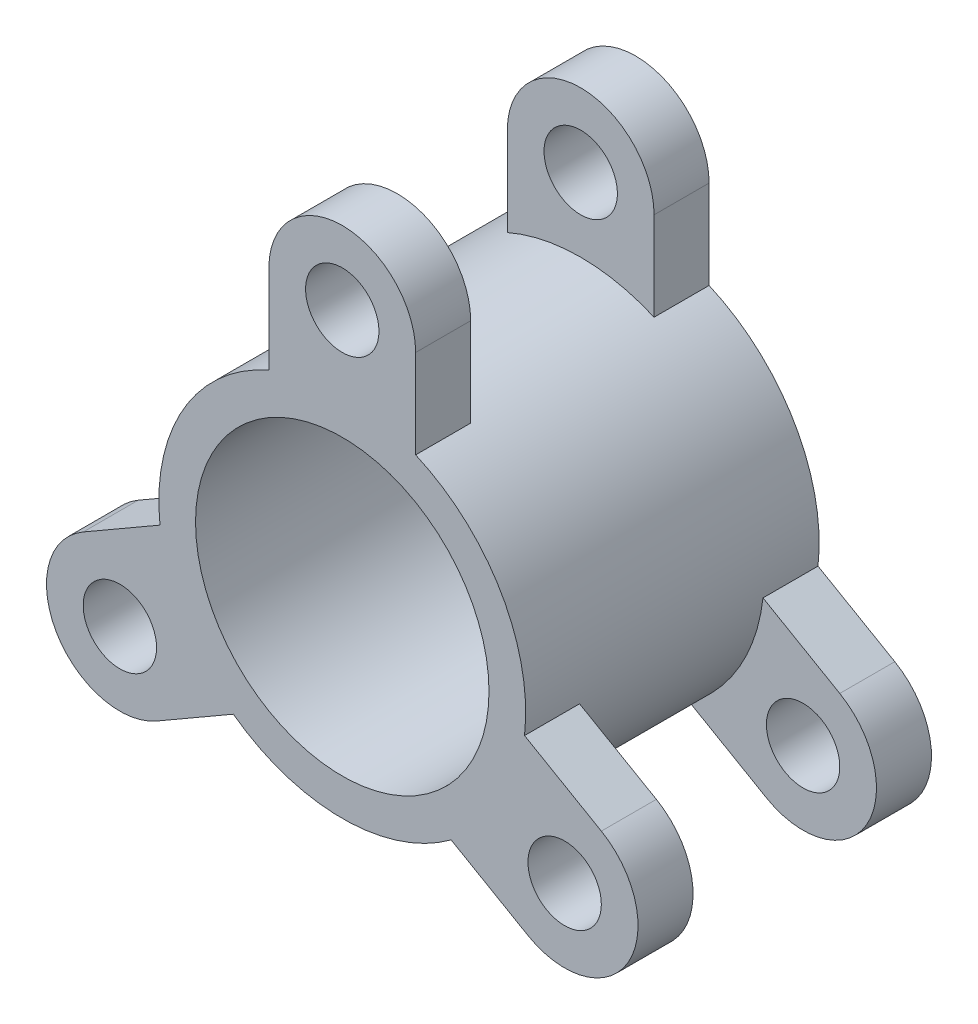
ISO-10303-21;
HEADER;
FILE_DESCRIPTION(('STEP AP214'),'2;1');
FILE_NAME('part.step','',(''),(''),'','','');
FILE_SCHEMA(('AUTOMOTIVE_DESIGN { 1 0 10303 214 1 1 1 1 }'));
ENDSEC;
DATA;
#1=APPLICATION_CONTEXT('core data for automotive mechanical design processes');
#2=APPLICATION_PROTOCOL_DEFINITION('international standard','automotive_design',2000,#1);
#3=PRODUCT_CONTEXT('',#1,'mechanical');
#4=PRODUCT('Part','Part','',(#3));
#5=PRODUCT_RELATED_PRODUCT_CATEGORY('part','',(#4));
#6=PRODUCT_DEFINITION_FORMATION('','',#4);
#7=PRODUCT_DEFINITION_CONTEXT('part definition',#1,'design');
#8=PRODUCT_DEFINITION('design','',#6,#7);
#9=PRODUCT_DEFINITION_SHAPE('','',#8);
#10=(LENGTH_UNIT() NAMED_UNIT(*) SI_UNIT(.MILLI.,.METRE.));
#11=(NAMED_UNIT(*) PLANE_ANGLE_UNIT() SI_UNIT($,.RADIAN.));
#12=(NAMED_UNIT(*) SI_UNIT($,.STERADIAN.) SOLID_ANGLE_UNIT());
#13=UNCERTAINTY_MEASURE_WITH_UNIT(LENGTH_MEASURE(1.E-05),#10,'distance_accuracy_value','');
#14=(GEOMETRIC_REPRESENTATION_CONTEXT(3) GLOBAL_UNCERTAINTY_ASSIGNED_CONTEXT((#13)) GLOBAL_UNIT_ASSIGNED_CONTEXT((#10,
#11,#12)) REPRESENTATION_CONTEXT('',''));
#15=CARTESIAN_POINT('',(0.,0.,0.));
#16=DIRECTION('',(0.,0.,1.));
#17=DIRECTION('',(1.,0.,0.));
#18=AXIS2_PLACEMENT_3D('',#15,#16,#17);
#19=CARTESIAN_POINT('',(20.,0.,80.));
#20=DIRECTION('',(1.,0.,0.));
#21=DIRECTION('',(0.,0.,-1.));
#22=AXIS2_PLACEMENT_3D('',#19,#20,#21);
#23=PLANE('',#22);
#24=DIRECTION('',(0.,1.,0.));
#25=VECTOR('',#24,1.);
#26=CARTESIAN_POINT('',(20.,0.,15.));
#27=LINE('',#26,#25);
#28=CARTESIAN_POINT('',(20.,45.8257569495584,15.));
#29=VERTEX_POINT('',#28);
#30=CARTESIAN_POINT('',(20.,70.,15.));
#31=VERTEX_POINT('',#30);
#32=EDGE_CURVE('E290',#29,#31,#27,.T.);
#33=ORIENTED_EDGE('',*,*,#32,.F.);
#34=DIRECTION('',(0.,0.,-1.));
#35=VECTOR('',#34,1.);
#36=CARTESIAN_POINT('',(20.,45.8257569495584,80.));
#37=LINE('',#36,#35);
#38=CARTESIAN_POINT('',(20.,45.8257569495584,0.));
#39=VERTEX_POINT('',#38);
#40=EDGE_CURVE('E51',#29,#39,#37,.T.);
#41=ORIENTED_EDGE('',*,*,#40,.T.);
#42=DIRECTION('',(0.,-1.,0.));
#43=VECTOR('',#42,1.);
#44=CARTESIAN_POINT('',(20.,0.,0.));
#45=LINE('',#44,#43);
#46=CARTESIAN_POINT('',(20.,70.,0.));
#47=VERTEX_POINT('',#46);
#48=EDGE_CURVE('E294',#47,#39,#45,.T.);
#49=ORIENTED_EDGE('',*,*,#48,.F.);
#50=DIRECTION('',(0.,0.,-1.));
#51=VECTOR('',#50,1.);
#52=CARTESIAN_POINT('',(20.,70.,80.));
#53=LINE('',#52,#51);
#54=EDGE_CURVE('E390',#31,#47,#53,.T.);
#55=ORIENTED_EDGE('',*,*,#54,.F.);
#56=EDGE_LOOP('',(#33,#41,#49,#55));
#57=FACE_BOUND('',#56,.T.);
#58=ADVANCED_FACE('F41',(#57),#23,.T.);
#59=CARTESIAN_POINT('',(0.,70.,80.));
#60=DIRECTION('',(0.,0.,-1.));
#61=DIRECTION('',(-1.,0.,0.));
#62=AXIS2_PLACEMENT_3D('',#59,#60,#61);
#63=CYLINDRICAL_SURFACE('',#62,20.);
#64=DIRECTION('',(0.,0.,-1.));
#65=VECTOR('',#64,1.);
#66=CARTESIAN_POINT('',(-20.,70.,80.));
#67=LINE('',#66,#65);
#68=CARTESIAN_POINT('',(-20.,70.,15.));
#69=VERTEX_POINT('',#68);
#70=CARTESIAN_POINT('',(-20.,70.,0.));
#71=VERTEX_POINT('',#70);
#72=EDGE_CURVE('E385',#69,#71,#67,.T.);
#73=ORIENTED_EDGE('',*,*,#72,.F.);
#74=CARTESIAN_POINT('',(0.,70.,15.));
#75=DIRECTION('',(0.,0.,-1.));
#76=DIRECTION('',(-1.,0.,0.));
#77=AXIS2_PLACEMENT_3D('',#74,#75,#76);
#78=CIRCLE('',#77,20.);
#79=EDGE_CURVE('E468',#69,#31,#78,.T.);
#80=ORIENTED_EDGE('',*,*,#79,.T.);
#81=ORIENTED_EDGE('',*,*,#54,.T.);
#82=CARTESIAN_POINT('',(0.,70.,0.));
#83=DIRECTION('',(0.,0.,1.));
#84=DIRECTION('',(1.,0.,0.));
#85=AXIS2_PLACEMENT_3D('',#82,#83,#84);
#86=CIRCLE('',#85,20.);
#87=EDGE_CURVE('E300',#47,#71,#86,.T.);
#88=ORIENTED_EDGE('',*,*,#87,.T.);
#89=EDGE_LOOP('',(#73,#80,#81,#88));
#90=FACE_BOUND('',#89,.T.);
#91=ADVANCED_FACE('F505',(#90),#63,.T.);
#92=CARTESIAN_POINT('',(-20.,0.,80.));
#93=DIRECTION('',(1.,0.,0.));
#94=DIRECTION('',(0.,0.,-1.));
#95=AXIS2_PLACEMENT_3D('',#92,#93,#94);
#96=PLANE('',#95);
#97=DIRECTION('',(0.,0.,-1.));
#98=VECTOR('',#97,1.);
#99=CARTESIAN_POINT('',(-20.,45.8257569495584,80.));
#100=LINE('',#99,#98);
#101=CARTESIAN_POINT('',(-20.,45.8257569495584,15.));
#102=VERTEX_POINT('',#101);
#103=CARTESIAN_POINT('',(-20.,45.8257569495584,0.));
#104=VERTEX_POINT('',#103);
#105=EDGE_CURVE('E382',#102,#104,#100,.T.);
#106=ORIENTED_EDGE('',*,*,#105,.F.);
#107=DIRECTION('',(0.,1.,0.));
#108=VECTOR('',#107,1.);
#109=CARTESIAN_POINT('',(-20.,0.,15.));
#110=LINE('',#109,#108);
#111=EDGE_CURVE('E464',#102,#69,#110,.T.);
#112=ORIENTED_EDGE('',*,*,#111,.T.);
#113=ORIENTED_EDGE('',*,*,#72,.T.);
#114=DIRECTION('',(0.,-1.,0.));
#115=VECTOR('',#114,1.);
#116=CARTESIAN_POINT('',(-20.,0.,0.));
#117=LINE('',#116,#115);
#118=EDGE_CURVE('E304',#71,#104,#117,.T.);
#119=ORIENTED_EDGE('',*,*,#118,.T.);
#120=EDGE_LOOP('',(#106,#112,#113,#119));
#121=FACE_BOUND('',#120,.T.);
#122=ADVANCED_FACE('F510',(#121),#96,.F.);
#123=CARTESIAN_POINT('',(-9.99999999999998,17.3205080756887,80.));
#124=DIRECTION('',(-0.5,0.866025403784438,0.));
#125=DIRECTION('',(-0.866025403784439,-0.5,0.));
#126=AXIS2_PLACEMENT_3D('',#123,#124,#125);
#127=PLANE('',#126);
#128=DIRECTION('',(-0.866025403784439,-0.5,0.));
#129=VECTOR('',#128,1.);
#130=CARTESIAN_POINT('',(-9.99999999999998,17.3205080756887,15.));
#131=LINE('',#130,#129);
#132=CARTESIAN_POINT('',(-49.6862696659689,-5.59237039909048,15.));
#133=VERTEX_POINT('',#132);
#134=CARTESIAN_POINT('',(-70.6217782649107,-17.6794919243113,15.));
#135=VERTEX_POINT('',#134);
#136=EDGE_CURVE('E461',#133,#135,#131,.T.);
#137=ORIENTED_EDGE('',*,*,#136,.F.);
#138=DIRECTION('',(0.,0.,-1.));
#139=VECTOR('',#138,1.);
#140=CARTESIAN_POINT('',(-49.6862696659689,-5.5923703990905,80.));
#141=LINE('',#140,#139);
#142=CARTESIAN_POINT('',(-49.6862696659689,-5.5923703990905,0.));
#143=VERTEX_POINT('',#142);
#144=EDGE_CURVE('E377',#133,#143,#141,.T.);
#145=ORIENTED_EDGE('',*,*,#144,.T.);
#146=DIRECTION('',(0.866025403784439,0.5,0.));
#147=VECTOR('',#146,1.);
#148=CARTESIAN_POINT('',(-9.99999999999998,17.3205080756887,0.));
#149=LINE('',#148,#147);
#150=CARTESIAN_POINT('',(-70.6217782649107,-17.6794919243113,0.));
#151=VERTEX_POINT('',#150);
#152=EDGE_CURVE('E308',#151,#143,#149,.T.);
#153=ORIENTED_EDGE('',*,*,#152,.F.);
#154=DIRECTION('',(0.,0.,-1.));
#155=VECTOR('',#154,1.);
#156=CARTESIAN_POINT('',(-70.6217782649107,-17.6794919243113,80.));
#157=LINE('',#156,#155);
#158=EDGE_CURVE('E372',#135,#151,#157,.T.);
#159=ORIENTED_EDGE('',*,*,#158,.F.);
#160=EDGE_LOOP('',(#137,#145,#153,#159));
#161=FACE_BOUND('',#160,.T.);
#162=ADVANCED_FACE('F532',(#161),#127,.T.);
#163=CARTESIAN_POINT('',(-60.6217782649107,-35.,80.));
#164=DIRECTION('',(0.,0.,-1.));
#165=DIRECTION('',(-1.,0.,0.));
#166=AXIS2_PLACEMENT_3D('',#163,#164,#165);
#167=CYLINDRICAL_SURFACE('',#166,20.);
#168=DIRECTION('',(0.,0.,-1.));
#169=VECTOR('',#168,1.);
#170=CARTESIAN_POINT('',(-50.6217782649107,-52.3205080756887,80.));
#171=LINE('',#170,#169);
#172=CARTESIAN_POINT('',(-50.6217782649107,-52.3205080756888,15.));
#173=VERTEX_POINT('',#172);
#174=CARTESIAN_POINT('',(-50.6217782649107,-52.3205080756887,0.));
#175=VERTEX_POINT('',#174);
#176=EDGE_CURVE('E367',#173,#175,#171,.T.);
#177=ORIENTED_EDGE('',*,*,#176,.F.);
#178=CARTESIAN_POINT('',(-60.6217782649107,-35.,15.));
#179=DIRECTION('',(0.,0.,-1.));
#180=DIRECTION('',(-1.,0.,0.));
#181=AXIS2_PLACEMENT_3D('',#178,#179,#180);
#182=CIRCLE('',#181,20.);
#183=EDGE_CURVE('E457',#173,#135,#182,.T.);
#184=ORIENTED_EDGE('',*,*,#183,.T.);
#185=ORIENTED_EDGE('',*,*,#158,.T.);
#186=CARTESIAN_POINT('',(-60.6217782649107,-35.,0.));
#187=DIRECTION('',(0.,0.,1.));
#188=DIRECTION('',(1.,0.,0.));
#189=AXIS2_PLACEMENT_3D('',#186,#187,#188);
#190=CIRCLE('',#189,20.);
#191=EDGE_CURVE('E312',#151,#175,#190,.T.);
#192=ORIENTED_EDGE('',*,*,#191,.T.);
#193=EDGE_LOOP('',(#177,#184,#185,#192));
#194=FACE_BOUND('',#193,.T.);
#195=ADVANCED_FACE('F537',(#194),#167,.T.);
#196=CARTESIAN_POINT('',(9.99999999999998,-17.3205080756887,80.));
#197=DIRECTION('',(-0.5,0.866025403784438,0.));
#198=DIRECTION('',(-0.866025403784438,-0.5,0.));
#199=AXIS2_PLACEMENT_3D('',#196,#197,#198);
#200=PLANE('',#199);
#201=DIRECTION('',(0.,0.,-1.));
#202=VECTOR('',#201,1.);
#203=CARTESIAN_POINT('',(-29.6862696659689,-40.233386550468,80.));
#204=LINE('',#203,#202);
#205=CARTESIAN_POINT('',(-29.6862696659689,-40.233386550468,15.));
#206=VERTEX_POINT('',#205);
#207=CARTESIAN_POINT('',(-29.6862696659689,-40.233386550468,0.));
#208=VERTEX_POINT('',#207);
#209=EDGE_CURVE('E363',#206,#208,#204,.T.);
#210=ORIENTED_EDGE('',*,*,#209,.F.);
#211=DIRECTION('',(-0.866025403784438,-0.5,0.));
#212=VECTOR('',#211,1.);
#213=CARTESIAN_POINT('',(9.99999999999998,-17.3205080756887,15.));
#214=LINE('',#213,#212);
#215=EDGE_CURVE('E453',#206,#173,#214,.T.);
#216=ORIENTED_EDGE('',*,*,#215,.T.);
#217=ORIENTED_EDGE('',*,*,#176,.T.);
#218=DIRECTION('',(0.866025403784438,0.5,0.));
#219=VECTOR('',#218,1.);
#220=CARTESIAN_POINT('',(9.99999999999998,-17.3205080756887,0.));
#221=LINE('',#220,#219);
#222=EDGE_CURVE('E316',#175,#208,#221,.T.);
#223=ORIENTED_EDGE('',*,*,#222,.T.);
#224=EDGE_LOOP('',(#210,#216,#217,#223));
#225=FACE_BOUND('',#224,.T.);
#226=ADVANCED_FACE('F541',(#225),#200,.F.);
#227=CARTESIAN_POINT('',(-9.99999999999998,-17.3205080756888,80.));
#228=DIRECTION('',(-0.5,-0.866025403784439,0.));
#229=DIRECTION('',(0.866025403784439,-0.5,0.));
#230=AXIS2_PLACEMENT_3D('',#227,#228,#229);
#231=PLANE('',#230);
#232=DIRECTION('',(0.866025403784439,-0.5,0.));
#233=VECTOR('',#232,1.);
#234=CARTESIAN_POINT('',(-9.99999999999998,-17.3205080756888,15.));
#235=LINE('',#234,#233);
#236=CARTESIAN_POINT('',(29.6862696659689,-40.2333865504679,15.));
#237=VERTEX_POINT('',#236);
#238=CARTESIAN_POINT('',(50.6217782649108,-52.3205080756887,15.));
#239=VERTEX_POINT('',#238);
#240=EDGE_CURVE('E442',#237,#239,#235,.T.);
#241=ORIENTED_EDGE('',*,*,#240,.F.);
#242=DIRECTION('',(0.,0.,-1.));
#243=VECTOR('',#242,1.);
#244=CARTESIAN_POINT('',(29.6862696659689,-40.2333865504679,80.));
#245=LINE('',#244,#243);
#246=CARTESIAN_POINT('',(29.6862696659689,-40.2333865504679,0.));
#247=VERTEX_POINT('',#246);
#248=EDGE_CURVE('E358',#237,#247,#245,.T.);
#249=ORIENTED_EDGE('',*,*,#248,.T.);
#250=DIRECTION('',(-0.866025403784439,0.5,0.));
#251=VECTOR('',#250,1.);
#252=CARTESIAN_POINT('',(-9.99999999999998,-17.3205080756888,0.));
#253=LINE('',#252,#251);
#254=CARTESIAN_POINT('',(50.6217782649108,-52.3205080756887,0.));
#255=VERTEX_POINT('',#254);
#256=EDGE_CURVE('E320',#255,#247,#253,.T.);
#257=ORIENTED_EDGE('',*,*,#256,.F.);
#258=DIRECTION('',(0.,0.,-1.));
#259=VECTOR('',#258,1.);
#260=CARTESIAN_POINT('',(50.6217782649108,-52.3205080756887,80.));
#261=LINE('',#260,#259);
#262=EDGE_CURVE('E353',#239,#255,#261,.T.);
#263=ORIENTED_EDGE('',*,*,#262,.F.);
#264=EDGE_LOOP('',(#241,#249,#257,#263));
#265=FACE_BOUND('',#264,.T.);
#266=ADVANCED_FACE('F549',(#265),#231,.T.);
#267=CARTESIAN_POINT('',(60.6217782649107,-35.,80.));
#268=DIRECTION('',(0.,0.,-1.));
#269=DIRECTION('',(-1.,0.,0.));
#270=AXIS2_PLACEMENT_3D('',#267,#268,#269);
#271=CYLINDRICAL_SURFACE('',#270,20.);
#272=DIRECTION('',(0.,0.,-1.));
#273=VECTOR('',#272,1.);
#274=CARTESIAN_POINT('',(70.6217782649107,-17.6794919243113,80.));
#275=LINE('',#274,#273);
#276=CARTESIAN_POINT('',(70.6217782649107,-17.6794919243113,15.));
#277=VERTEX_POINT('',#276);
#278=CARTESIAN_POINT('',(70.6217782649107,-17.6794919243113,0.));
#279=VERTEX_POINT('',#278);
#280=EDGE_CURVE('E348',#277,#279,#275,.T.);
#281=ORIENTED_EDGE('',*,*,#280,.F.);
#282=CARTESIAN_POINT('',(60.6217782649107,-35.,15.));
#283=DIRECTION('',(0.,0.,-1.));
#284=DIRECTION('',(-1.,0.,0.));
#285=AXIS2_PLACEMENT_3D('',#282,#283,#284);
#286=CIRCLE('',#285,20.);
#287=EDGE_CURVE('E438',#277,#239,#286,.T.);
#288=ORIENTED_EDGE('',*,*,#287,.T.);
#289=ORIENTED_EDGE('',*,*,#262,.T.);
#290=CARTESIAN_POINT('',(60.6217782649107,-35.,0.));
#291=DIRECTION('',(0.,0.,1.));
#292=DIRECTION('',(1.,0.,0.));
#293=AXIS2_PLACEMENT_3D('',#290,#291,#292);
#294=CIRCLE('',#293,20.);
#295=EDGE_CURVE('E324',#255,#279,#294,.T.);
#296=ORIENTED_EDGE('',*,*,#295,.T.);
#297=EDGE_LOOP('',(#281,#288,#289,#296));
#298=FACE_BOUND('',#297,.T.);
#299=ADVANCED_FACE('F554',(#298),#271,.T.);
#300=CARTESIAN_POINT('',(-60.6217782649107,-35.,80.));
#301=DIRECTION('',(0.,0.,-1.));
#302=DIRECTION('',(-1.,0.,0.));
#303=AXIS2_PLACEMENT_3D('',#300,#301,#302);
#304=CYLINDRICAL_SURFACE('',#303,9.99999999999999);
#305=CARTESIAN_POINT('',(-60.6217782649107,-35.,15.));
#306=DIRECTION('',(0.,0.,-1.));
#307=DIRECTION('',(-1.,0.,0.));
#308=AXIS2_PLACEMENT_3D('',#305,#306,#307);
#309=CIRCLE('',#308,9.99999999999999);
#310=CARTESIAN_POINT('',(-70.6217782649107,-35.,15.));
#311=VERTEX_POINT('',#310);
#312=EDGE_CURVE('E449',#311,#311,#309,.T.);
#313=ORIENTED_EDGE('',*,*,#312,.F.);
#314=EDGE_LOOP('',(#313));
#315=FACE_BOUND('',#314,.T.);
#316=CARTESIAN_POINT('',(-60.6217782649107,-35.,0.));
#317=DIRECTION('',(0.,0.,1.));
#318=DIRECTION('',(1.,0.,0.));
#319=AXIS2_PLACEMENT_3D('',#316,#317,#318);
#320=CIRCLE('',#319,9.99999999999999);
#321=CARTESIAN_POINT('',(-50.6217782649107,-35.,0.));
#322=VERTEX_POINT('',#321);
#323=EDGE_CURVE('E336',#322,#322,#320,.T.);
#324=ORIENTED_EDGE('',*,*,#323,.F.);
#325=EDGE_LOOP('',(#324));
#326=FACE_BOUND('',#325,.T.);
#327=ADVANCED_FACE('F563',(#315,#326),#304,.F.);
#328=CARTESIAN_POINT('',(60.6217782649107,-35.,80.));
#329=DIRECTION('',(0.,0.,-1.));
#330=DIRECTION('',(-1.,0.,0.));
#331=AXIS2_PLACEMENT_3D('',#328,#329,#330);
#332=CYLINDRICAL_SURFACE('',#331,10.);
#333=CARTESIAN_POINT('',(60.6217782649107,-35.,15.));
#334=DIRECTION('',(0.,0.,-1.));
#335=DIRECTION('',(-1.,0.,0.));
#336=AXIS2_PLACEMENT_3D('',#333,#334,#335);
#337=CIRCLE('',#336,10.);
#338=CARTESIAN_POINT('',(50.6217782649107,-35.,15.));
#339=VERTEX_POINT('',#338);
#340=EDGE_CURVE('E445',#339,#339,#337,.T.);
#341=ORIENTED_EDGE('',*,*,#340,.F.);
#342=EDGE_LOOP('',(#341));
#343=FACE_BOUND('',#342,.T.);
#344=CARTESIAN_POINT('',(60.6217782649107,-35.,0.));
#345=DIRECTION('',(0.,0.,1.));
#346=DIRECTION('',(1.,0.,0.));
#347=AXIS2_PLACEMENT_3D('',#344,#345,#346);
#348=CIRCLE('',#347,10.);
#349=CARTESIAN_POINT('',(70.6217782649107,-35.,0.));
#350=VERTEX_POINT('',#349);
#351=EDGE_CURVE('E332',#350,#350,#348,.T.);
#352=ORIENTED_EDGE('',*,*,#351,.F.);
#353=EDGE_LOOP('',(#352));
#354=FACE_BOUND('',#353,.T.);
#355=ADVANCED_FACE('F560',(#343,#354),#332,.F.);
#356=CARTESIAN_POINT('',(9.99999999999994,17.3205080756887,80.));
#357=DIRECTION('',(-0.499999999999999,-0.866025403784439,0.));
#358=DIRECTION('',(0.866025403784439,-0.499999999999999,0.));
#359=AXIS2_PLACEMENT_3D('',#356,#357,#358);
#360=PLANE('',#359);
#361=DIRECTION('',(0.,0.,-1.));
#362=VECTOR('',#361,1.);
#363=CARTESIAN_POINT('',(49.6862696659689,-5.59237039909049,80.));
#364=LINE('',#363,#362);
#365=CARTESIAN_POINT('',(49.6862696659689,-5.59237039909049,15.));
#366=VERTEX_POINT('',#365);
#367=CARTESIAN_POINT('',(49.6862696659689,-5.59237039909049,0.));
#368=VERTEX_POINT('',#367);
#369=EDGE_CURVE('E284',#366,#368,#364,.T.);
#370=ORIENTED_EDGE('',*,*,#369,.F.);
#371=DIRECTION('',(0.866025403784439,-0.499999999999999,0.));
#372=VECTOR('',#371,1.);
#373=CARTESIAN_POINT('',(9.99999999999994,17.3205080756887,15.));
#374=LINE('',#373,#372);
#375=EDGE_CURVE('E434',#366,#277,#374,.T.);
#376=ORIENTED_EDGE('',*,*,#375,.T.);
#377=ORIENTED_EDGE('',*,*,#280,.T.);
#378=DIRECTION('',(-0.866025403784439,0.499999999999999,0.));
#379=VECTOR('',#378,1.);
#380=CARTESIAN_POINT('',(9.99999999999994,17.3205080756887,0.));
#381=LINE('',#380,#379);
#382=EDGE_CURVE('E328',#279,#368,#381,.T.);
#383=ORIENTED_EDGE('',*,*,#382,.T.);
#384=EDGE_LOOP('',(#370,#376,#377,#383));
#385=FACE_BOUND('',#384,.T.);
#386=ADVANCED_FACE('F502',(#385),#360,.F.);
#387=CARTESIAN_POINT('',(0.,70.,80.));
#388=DIRECTION('',(0.,0.,-1.));
#389=DIRECTION('',(-1.,0.,0.));
#390=AXIS2_PLACEMENT_3D('',#387,#388,#389);
#391=CYLINDRICAL_SURFACE('',#390,10.);
#392=CARTESIAN_POINT('',(0.,70.,15.));
#393=DIRECTION('',(0.,0.,-1.));
#394=DIRECTION('',(-1.,0.,0.));
#395=AXIS2_PLACEMENT_3D('',#392,#393,#394);
#396=CIRCLE('',#395,10.);
#397=CARTESIAN_POINT('',(-10.,70.,15.));
#398=VERTEX_POINT('',#397);
#399=EDGE_CURVE('E45',#398,#398,#396,.T.);
#400=ORIENTED_EDGE('',*,*,#399,.F.);
#401=EDGE_LOOP('',(#400));
#402=FACE_BOUND('',#401,.T.);
#403=CARTESIAN_POINT('',(0.,70.,0.));
#404=DIRECTION('',(0.,0.,1.));
#405=DIRECTION('',(1.,0.,0.));
#406=AXIS2_PLACEMENT_3D('',#403,#404,#405);
#407=CIRCLE('',#406,10.);
#408=CARTESIAN_POINT('',(10.,70.,0.));
#409=VERTEX_POINT('',#408);
#410=EDGE_CURVE('E340',#409,#409,#407,.T.);
#411=ORIENTED_EDGE('',*,*,#410,.F.);
#412=EDGE_LOOP('',(#411));
#413=FACE_BOUND('',#412,.T.);
#414=ADVANCED_FACE('F494',(#402,#413),#391,.F.);
#415=DIRECTION('',(0.,-1.,0.));
#416=VECTOR('',#415,1.);
#417=CARTESIAN_POINT('',(20.,0.,65.));
#418=LINE('',#417,#416);
#419=CARTESIAN_POINT('',(20.,70.,65.));
#420=VERTEX_POINT('',#419);
#421=CARTESIAN_POINT('',(20.,45.8257569495584,65.));
#422=VERTEX_POINT('',#421);
#423=EDGE_CURVE('E203',#420,#422,#418,.T.);
#424=ORIENTED_EDGE('',*,*,#423,.F.);
#425=CARTESIAN_POINT('',(20.,70.,80.));
#426=VERTEX_POINT('',#425);
#427=EDGE_CURVE('E233',#426,#420,#53,.T.);
#428=ORIENTED_EDGE('',*,*,#427,.F.);
#429=DIRECTION('',(0.,-1.,0.));
#430=VECTOR('',#429,1.);
#431=CARTESIAN_POINT('',(20.,0.,80.));
#432=LINE('',#431,#430);
#433=CARTESIAN_POINT('',(20.,45.8257569495584,80.));
#434=VERTEX_POINT('',#433);
#435=EDGE_CURVE('E232',#426,#434,#432,.T.);
#436=ORIENTED_EDGE('',*,*,#435,.T.);
#437=EDGE_CURVE('E11',#434,#422,#37,.T.);
#438=ORIENTED_EDGE('',*,*,#437,.T.);
#439=EDGE_LOOP('',(#424,#428,#436,#438));
#440=FACE_BOUND('',#439,.T.);
#441=ADVANCED_FACE('F230',(#440),#23,.T.);
#442=ORIENTED_EDGE('',*,*,#427,.T.);
#443=CARTESIAN_POINT('',(0.,70.,65.));
#444=DIRECTION('',(0.,0.,1.));
#445=DIRECTION('',(1.,0.,0.));
#446=AXIS2_PLACEMENT_3D('',#443,#444,#445);
#447=CIRCLE('',#446,20.);
#448=CARTESIAN_POINT('',(-20.,70.,65.));
#449=VERTEX_POINT('',#448);
#450=EDGE_CURVE('E210',#420,#449,#447,.T.);
#451=ORIENTED_EDGE('',*,*,#450,.T.);
#452=CARTESIAN_POINT('',(-20.,70.,80.));
#453=VERTEX_POINT('',#452);
#454=EDGE_CURVE('E386',#453,#449,#67,.T.);
#455=ORIENTED_EDGE('',*,*,#454,.F.);
#456=CARTESIAN_POINT('',(0.,70.,80.));
#457=DIRECTION('',(0.,0.,1.));
#458=DIRECTION('',(1.,0.,0.));
#459=AXIS2_PLACEMENT_3D('',#456,#457,#458);
#460=CIRCLE('',#459,20.);
#461=EDGE_CURVE('E237',#426,#453,#460,.T.);
#462=ORIENTED_EDGE('',*,*,#461,.F.);
#463=EDGE_LOOP('',(#442,#451,#455,#462));
#464=FACE_BOUND('',#463,.T.);
#465=ADVANCED_FACE('F513',(#464),#63,.T.);
#466=ORIENTED_EDGE('',*,*,#454,.T.);
#467=DIRECTION('',(0.,-1.,0.));
#468=VECTOR('',#467,1.);
#469=CARTESIAN_POINT('',(-20.,0.,65.));
#470=LINE('',#469,#468);
#471=CARTESIAN_POINT('',(-20.,45.8257569495584,65.));
#472=VERTEX_POINT('',#471);
#473=EDGE_CURVE('E429',#449,#472,#470,.T.);
#474=ORIENTED_EDGE('',*,*,#473,.T.);
#475=CARTESIAN_POINT('',(-20.,45.8257569495584,80.));
#476=VERTEX_POINT('',#475);
#477=EDGE_CURVE('E224',#476,#472,#100,.T.);
#478=ORIENTED_EDGE('',*,*,#477,.F.);
#479=DIRECTION('',(0.,-1.,0.));
#480=VECTOR('',#479,1.);
#481=CARTESIAN_POINT('',(-20.,0.,80.));
#482=LINE('',#481,#480);
#483=EDGE_CURVE('E242',#453,#476,#482,.T.);
#484=ORIENTED_EDGE('',*,*,#483,.F.);
#485=EDGE_LOOP('',(#466,#474,#478,#484));
#486=FACE_BOUND('',#485,.T.);
#487=ADVANCED_FACE('F519',(#486),#96,.F.);
#488=DIRECTION('',(0.866025403784439,0.5,0.));
#489=VECTOR('',#488,1.);
#490=CARTESIAN_POINT('',(-9.99999999999998,17.3205080756887,65.));
#491=LINE('',#490,#489);
#492=CARTESIAN_POINT('',(-70.6217782649107,-17.6794919243113,65.));
#493=VERTEX_POINT('',#492);
#494=CARTESIAN_POINT('',(-49.6862696659689,-5.59237039909049,65.));
#495=VERTEX_POINT('',#494);
#496=EDGE_CURVE('E426',#493,#495,#491,.T.);
#497=ORIENTED_EDGE('',*,*,#496,.F.);
#498=CARTESIAN_POINT('',(-70.6217782649107,-17.6794919243113,80.));
#499=VERTEX_POINT('',#498);
#500=EDGE_CURVE('E373',#499,#493,#157,.T.);
#501=ORIENTED_EDGE('',*,*,#500,.F.);
#502=DIRECTION('',(0.866025403784439,0.5,0.));
#503=VECTOR('',#502,1.);
#504=CARTESIAN_POINT('',(-9.99999999999998,17.3205080756887,80.));
#505=LINE('',#504,#503);
#506=CARTESIAN_POINT('',(-49.6862696659689,-5.5923703990905,80.));
#507=VERTEX_POINT('',#506);
#508=EDGE_CURVE('E252',#499,#507,#505,.T.);
#509=ORIENTED_EDGE('',*,*,#508,.T.);
#510=EDGE_CURVE('E378',#507,#495,#141,.T.);
#511=ORIENTED_EDGE('',*,*,#510,.T.);
#512=EDGE_LOOP('',(#497,#501,#509,#511));
#513=FACE_BOUND('',#512,.T.);
#514=ADVANCED_FACE('F524',(#513),#127,.T.);
#515=ORIENTED_EDGE('',*,*,#500,.T.);
#516=CARTESIAN_POINT('',(-60.6217782649107,-35.,65.));
#517=DIRECTION('',(0.,0.,1.));
#518=DIRECTION('',(1.,0.,0.));
#519=AXIS2_PLACEMENT_3D('',#516,#517,#518);
#520=CIRCLE('',#519,20.);
#521=CARTESIAN_POINT('',(-50.6217782649107,-52.3205080756888,65.));
#522=VERTEX_POINT('',#521);
#523=EDGE_CURVE('E422',#493,#522,#520,.T.);
#524=ORIENTED_EDGE('',*,*,#523,.T.);
#525=CARTESIAN_POINT('',(-50.6217782649107,-52.3205080756887,80.));
#526=VERTEX_POINT('',#525);
#527=EDGE_CURVE('E368',#526,#522,#171,.T.);
#528=ORIENTED_EDGE('',*,*,#527,.F.);
#529=CARTESIAN_POINT('',(-60.6217782649107,-35.,80.));
#530=DIRECTION('',(0.,0.,1.));
#531=DIRECTION('',(1.,0.,0.));
#532=AXIS2_PLACEMENT_3D('',#529,#530,#531);
#533=CIRCLE('',#532,20.);
#534=EDGE_CURVE('E256',#499,#526,#533,.T.);
#535=ORIENTED_EDGE('',*,*,#534,.F.);
#536=EDGE_LOOP('',(#515,#524,#528,#535));
#537=FACE_BOUND('',#536,.T.);
#538=ADVANCED_FACE('F530',(#537),#167,.T.);
#539=ORIENTED_EDGE('',*,*,#527,.T.);
#540=DIRECTION('',(0.866025403784438,0.5,0.));
#541=VECTOR('',#540,1.);
#542=CARTESIAN_POINT('',(9.99999999999998,-17.3205080756887,65.));
#543=LINE('',#542,#541);
#544=CARTESIAN_POINT('',(-29.6862696659689,-40.233386550468,65.));
#545=VERTEX_POINT('',#544);
#546=EDGE_CURVE('E418',#522,#545,#543,.T.);
#547=ORIENTED_EDGE('',*,*,#546,.T.);
#548=CARTESIAN_POINT('',(-29.6862696659689,-40.233386550468,80.));
#549=VERTEX_POINT('',#548);
#550=EDGE_CURVE('E364',#549,#545,#204,.T.);
#551=ORIENTED_EDGE('',*,*,#550,.F.);
#552=DIRECTION('',(0.866025403784438,0.5,0.));
#553=VECTOR('',#552,1.);
#554=CARTESIAN_POINT('',(9.99999999999998,-17.3205080756887,80.));
#555=LINE('',#554,#553);
#556=EDGE_CURVE('E259',#526,#549,#555,.T.);
#557=ORIENTED_EDGE('',*,*,#556,.F.);
#558=EDGE_LOOP('',(#539,#547,#551,#557));
#559=FACE_BOUND('',#558,.T.);
#560=ADVANCED_FACE('F535',(#559),#200,.F.);
#561=CARTESIAN_POINT('',(0.,0.,80.));
#562=DIRECTION('',(0.,0.,-1.));
#563=DIRECTION('',(-1.,0.,0.));
#564=AXIS2_PLACEMENT_3D('',#561,#562,#563);
#565=CYLINDRICAL_SURFACE('',#564,50.);
#566=CARTESIAN_POINT('',(0.,0.,15.));
#567=DIRECTION('',(0.,0.,1.));
#568=DIRECTION('',(1.,0.,0.));
#569=AXIS2_PLACEMENT_3D('',#566,#567,#568);
#570=CIRCLE('',#569,50.);
#571=EDGE_CURVE('E634',#237,#366,#570,.T.);
#572=ORIENTED_EDGE('',*,*,#571,.T.);
#573=ORIENTED_EDGE('',*,*,#369,.T.);
#574=CARTESIAN_POINT('',(0.,0.,0.));
#575=DIRECTION('',(0.,0.,1.));
#576=DIRECTION('',(1.,0.,0.));
#577=AXIS2_PLACEMENT_3D('',#574,#575,#576);
#578=CIRCLE('',#577,50.);
#579=EDGE_CURVE('E289',#368,#39,#578,.T.);
#580=ORIENTED_EDGE('',*,*,#579,.T.);
#581=ORIENTED_EDGE('',*,*,#40,.F.);
#582=EDGE_CURVE('E59',#29,#102,#570,.T.);
#583=ORIENTED_EDGE('',*,*,#582,.T.);
#584=ORIENTED_EDGE('',*,*,#105,.T.);
#585=EDGE_CURVE('E296',#104,#143,#578,.T.);
#586=ORIENTED_EDGE('',*,*,#585,.T.);
#587=ORIENTED_EDGE('',*,*,#144,.F.);
#588=EDGE_CURVE('E66',#133,#206,#570,.T.);
#589=ORIENTED_EDGE('',*,*,#588,.T.);
#590=ORIENTED_EDGE('',*,*,#209,.T.);
#591=EDGE_CURVE('E295',#208,#247,#578,.T.);
#592=ORIENTED_EDGE('',*,*,#591,.T.);
#593=ORIENTED_EDGE('',*,*,#248,.F.);
#594=EDGE_LOOP('',(#572,#573,#580,#581,#583,#584,#586,#587,#589,#590,#592,#593));
#595=FACE_BOUND('',#594,.T.);
#596=ORIENTED_EDGE('',*,*,#550,.T.);
#597=CARTESIAN_POINT('',(0.,0.,65.));
#598=DIRECTION('',(0.,0.,1.));
#599=DIRECTION('',(1.,0.,0.));
#600=AXIS2_PLACEMENT_3D('',#597,#598,#599);
#601=CIRCLE('',#600,50.);
#602=EDGE_CURVE('E227',#495,#545,#601,.T.);
#603=ORIENTED_EDGE('',*,*,#602,.F.);
#604=ORIENTED_EDGE('',*,*,#510,.F.);
#605=CARTESIAN_POINT('',(0.,0.,80.));
#606=DIRECTION('',(0.,0.,1.));
#607=DIRECTION('',(1.,0.,0.));
#608=AXIS2_PLACEMENT_3D('',#605,#606,#607);
#609=CIRCLE('',#608,50.);
#610=EDGE_CURVE('E247',#476,#507,#609,.T.);
#611=ORIENTED_EDGE('',*,*,#610,.F.);
#612=ORIENTED_EDGE('',*,*,#477,.T.);
#613=EDGE_CURVE('E207',#422,#472,#601,.T.);
#614=ORIENTED_EDGE('',*,*,#613,.F.);
#615=ORIENTED_EDGE('',*,*,#437,.F.);
#616=CARTESIAN_POINT('',(49.6862696659689,-5.59237039909049,80.));
#617=VERTEX_POINT('',#616);
#618=EDGE_CURVE('E238',#617,#434,#609,.T.);
#619=ORIENTED_EDGE('',*,*,#618,.F.);
#620=CARTESIAN_POINT('',(49.6862696659689,-5.59237039909048,65.));
#621=VERTEX_POINT('',#620);
#622=EDGE_CURVE('E344',#617,#621,#364,.T.);
#623=ORIENTED_EDGE('',*,*,#622,.T.);
#624=CARTESIAN_POINT('',(29.6862696659689,-40.2333865504679,65.));
#625=VERTEX_POINT('',#624);
#626=EDGE_CURVE('E229',#625,#621,#601,.T.);
#627=ORIENTED_EDGE('',*,*,#626,.F.);
#628=CARTESIAN_POINT('',(29.6862696659689,-40.2333865504679,80.));
#629=VERTEX_POINT('',#628);
#630=EDGE_CURVE('E359',#629,#625,#245,.T.);
#631=ORIENTED_EDGE('',*,*,#630,.F.);
#632=EDGE_CURVE('E246',#549,#629,#609,.T.);
#633=ORIENTED_EDGE('',*,*,#632,.F.);
#634=EDGE_LOOP('',(#596,#603,#604,#611,#612,#614,#615,#619,#623,#627,#631,#633));
#635=FACE_BOUND('',#634,.T.);
#636=ADVANCED_FACE('F219',(#595,#635),#565,.T.);
#637=DIRECTION('',(-0.866025403784439,0.5,0.));
#638=VECTOR('',#637,1.);
#639=CARTESIAN_POINT('',(-9.99999999999998,-17.3205080756888,65.));
#640=LINE('',#639,#638);
#641=CARTESIAN_POINT('',(50.6217782649108,-52.3205080756887,65.));
#642=VERTEX_POINT('',#641);
#643=EDGE_CURVE('E404',#642,#625,#640,.T.);
#644=ORIENTED_EDGE('',*,*,#643,.F.);
#645=CARTESIAN_POINT('',(50.6217782649108,-52.3205080756887,80.));
#646=VERTEX_POINT('',#645);
#647=EDGE_CURVE('E354',#646,#642,#261,.T.);
#648=ORIENTED_EDGE('',*,*,#647,.F.);
#649=DIRECTION('',(-0.866025403784439,0.5,0.));
#650=VECTOR('',#649,1.);
#651=CARTESIAN_POINT('',(-9.99999999999998,-17.3205080756888,80.));
#652=LINE('',#651,#650);
#653=EDGE_CURVE('E262',#646,#629,#652,.T.);
#654=ORIENTED_EDGE('',*,*,#653,.T.);
#655=ORIENTED_EDGE('',*,*,#630,.T.);
#656=EDGE_LOOP('',(#644,#648,#654,#655));
#657=FACE_BOUND('',#656,.T.);
#658=ADVANCED_FACE('F544',(#657),#231,.T.);
#659=ORIENTED_EDGE('',*,*,#647,.T.);
#660=CARTESIAN_POINT('',(60.6217782649107,-35.,65.));
#661=DIRECTION('',(0.,0.,1.));
#662=DIRECTION('',(1.,0.,0.));
#663=AXIS2_PLACEMENT_3D('',#660,#661,#662);
#664=CIRCLE('',#663,20.);
#665=CARTESIAN_POINT('',(70.6217782649107,-17.6794919243113,65.));
#666=VERTEX_POINT('',#665);
#667=EDGE_CURVE('E398',#642,#666,#664,.T.);
#668=ORIENTED_EDGE('',*,*,#667,.T.);
#669=CARTESIAN_POINT('',(70.6217782649107,-17.6794919243113,80.));
#670=VERTEX_POINT('',#669);
#671=EDGE_CURVE('E349',#670,#666,#275,.T.);
#672=ORIENTED_EDGE('',*,*,#671,.F.);
#673=CARTESIAN_POINT('',(60.6217782649107,-35.,80.));
#674=DIRECTION('',(0.,0.,1.));
#675=DIRECTION('',(1.,0.,0.));
#676=AXIS2_PLACEMENT_3D('',#673,#674,#675);
#677=CIRCLE('',#676,20.);
#678=EDGE_CURVE('E266',#646,#670,#677,.T.);
#679=ORIENTED_EDGE('',*,*,#678,.F.);
#680=EDGE_LOOP('',(#659,#668,#672,#679));
#681=FACE_BOUND('',#680,.T.);
#682=ADVANCED_FACE('F547',(#681),#271,.T.);
#683=CARTESIAN_POINT('',(-60.6217782649107,-35.,65.));
#684=DIRECTION('',(0.,0.,1.));
#685=DIRECTION('',(1.,0.,0.));
#686=AXIS2_PLACEMENT_3D('',#683,#684,#685);
#687=CIRCLE('',#686,9.99999999999999);
#688=CARTESIAN_POINT('',(-50.6217782649107,-35.,65.));
#689=VERTEX_POINT('',#688);
#690=EDGE_CURVE('E414',#689,#689,#687,.T.);
#691=ORIENTED_EDGE('',*,*,#690,.F.);
#692=EDGE_LOOP('',(#691));
#693=FACE_BOUND('',#692,.T.);
#694=CARTESIAN_POINT('',(-60.6217782649107,-35.,80.));
#695=DIRECTION('',(0.,0.,1.));
#696=DIRECTION('',(1.,0.,0.));
#697=AXIS2_PLACEMENT_3D('',#694,#695,#696);
#698=CIRCLE('',#697,9.99999999999999);
#699=CARTESIAN_POINT('',(-50.6217782649107,-35.,80.));
#700=VERTEX_POINT('',#699);
#701=EDGE_CURVE('E276',#700,#700,#698,.T.);
#702=ORIENTED_EDGE('',*,*,#701,.T.);
#703=EDGE_LOOP('',(#702));
#704=FACE_BOUND('',#703,.T.);
#705=ADVANCED_FACE('F552',(#693,#704),#304,.F.);
#706=CARTESIAN_POINT('',(60.6217782649107,-35.,65.));
#707=DIRECTION('',(0.,0.,1.));
#708=DIRECTION('',(1.,0.,0.));
#709=AXIS2_PLACEMENT_3D('',#706,#707,#708);
#710=CIRCLE('',#709,10.);
#711=CARTESIAN_POINT('',(70.6217782649107,-35.,65.));
#712=VERTEX_POINT('',#711);
#713=EDGE_CURVE('E410',#712,#712,#710,.T.);
#714=ORIENTED_EDGE('',*,*,#713,.F.);
#715=EDGE_LOOP('',(#714));
#716=FACE_BOUND('',#715,.T.);
#717=CARTESIAN_POINT('',(60.6217782649107,-35.,80.));
#718=DIRECTION('',(0.,0.,1.));
#719=DIRECTION('',(1.,0.,0.));
#720=AXIS2_PLACEMENT_3D('',#717,#718,#719);
#721=CIRCLE('',#720,10.);
#722=CARTESIAN_POINT('',(70.6217782649107,-35.,80.));
#723=VERTEX_POINT('',#722);
#724=EDGE_CURVE('E272',#723,#723,#721,.T.);
#725=ORIENTED_EDGE('',*,*,#724,.T.);
#726=EDGE_LOOP('',(#725));
#727=FACE_BOUND('',#726,.T.);
#728=ADVANCED_FACE('F557',(#716,#727),#332,.F.);
#729=ORIENTED_EDGE('',*,*,#671,.T.);
#730=DIRECTION('',(-0.866025403784439,0.499999999999999,0.));
#731=VECTOR('',#730,1.);
#732=CARTESIAN_POINT('',(9.99999999999994,17.3205080756887,65.));
#733=LINE('',#732,#731);
#734=EDGE_CURVE('E394',#666,#621,#733,.T.);
#735=ORIENTED_EDGE('',*,*,#734,.T.);
#736=ORIENTED_EDGE('',*,*,#622,.F.);
#737=DIRECTION('',(-0.866025403784439,0.499999999999999,0.));
#738=VECTOR('',#737,1.);
#739=CARTESIAN_POINT('',(9.99999999999994,17.3205080756887,80.));
#740=LINE('',#739,#738);
#741=EDGE_CURVE('E269',#670,#617,#740,.T.);
#742=ORIENTED_EDGE('',*,*,#741,.F.);
#743=EDGE_LOOP('',(#729,#735,#736,#742));
#744=FACE_BOUND('',#743,.T.);
#745=ADVANCED_FACE('F498',(#744),#360,.F.);
#746=CARTESIAN_POINT('',(0.,0.,80.));
#747=DIRECTION('',(0.,0.,-1.));
#748=DIRECTION('',(-1.,0.,0.));
#749=AXIS2_PLACEMENT_3D('',#746,#747,#748);
#750=CYLINDRICAL_SURFACE('',#749,40.);
#751=CARTESIAN_POINT('',(0.,0.,80.));
#752=DIRECTION('',(0.,0.,1.));
#753=DIRECTION('',(1.,0.,0.));
#754=AXIS2_PLACEMENT_3D('',#751,#752,#753);
#755=CIRCLE('',#754,40.);
#756=CARTESIAN_POINT('',(40.,0.,80.));
#757=VERTEX_POINT('',#756);
#758=EDGE_CURVE('E244',#757,#757,#755,.T.);
#759=ORIENTED_EDGE('',*,*,#758,.T.);
#760=EDGE_LOOP('',(#759));
#761=FACE_BOUND('',#760,.T.);
#762=CARTESIAN_POINT('',(0.,0.,0.));
#763=DIRECTION('',(0.,0.,1.));
#764=DIRECTION('',(1.,0.,0.));
#765=AXIS2_PLACEMENT_3D('',#762,#763,#764);
#766=CIRCLE('',#765,40.);
#767=CARTESIAN_POINT('',(40.,0.,0.));
#768=VERTEX_POINT('',#767);
#769=EDGE_CURVE('E285',#768,#768,#766,.T.);
#770=ORIENTED_EDGE('',*,*,#769,.F.);
#771=EDGE_LOOP('',(#770));
#772=FACE_BOUND('',#771,.T.);
#773=ADVANCED_FACE('F43',(#761,#772),#750,.F.);
#774=CARTESIAN_POINT('',(0.,70.,65.));
#775=DIRECTION('',(0.,0.,1.));
#776=DIRECTION('',(1.,0.,0.));
#777=AXIS2_PLACEMENT_3D('',#774,#775,#776);
#778=CIRCLE('',#777,10.);
#779=CARTESIAN_POINT('',(10.,70.,65.));
#780=VERTEX_POINT('',#779);
#781=EDGE_CURVE('E226',#780,#780,#778,.T.);
#782=ORIENTED_EDGE('',*,*,#781,.F.);
#783=EDGE_LOOP('',(#782));
#784=FACE_BOUND('',#783,.T.);
#785=CARTESIAN_POINT('',(0.,70.,80.));
#786=DIRECTION('',(0.,0.,1.));
#787=DIRECTION('',(1.,0.,0.));
#788=AXIS2_PLACEMENT_3D('',#785,#786,#787);
#789=CIRCLE('',#788,10.);
#790=CARTESIAN_POINT('',(10.,70.,80.));
#791=VERTEX_POINT('',#790);
#792=EDGE_CURVE('E280',#791,#791,#789,.T.);
#793=ORIENTED_EDGE('',*,*,#792,.T.);
#794=EDGE_LOOP('',(#793));
#795=FACE_BOUND('',#794,.T.);
#796=ADVANCED_FACE('F482',(#784,#795),#391,.F.);
#797=CARTESIAN_POINT('',(0.,0.,80.));
#798=DIRECTION('',(0.,0.,1.));
#799=DIRECTION('',(1.,0.,0.));
#800=AXIS2_PLACEMENT_3D('',#797,#798,#799);
#801=PLANE('',#800);
#802=ORIENTED_EDGE('',*,*,#758,.F.);
#803=EDGE_LOOP('',(#802));
#804=FACE_BOUND('',#803,.T.);
#805=ORIENTED_EDGE('',*,*,#618,.T.);
#806=ORIENTED_EDGE('',*,*,#435,.F.);
#807=ORIENTED_EDGE('',*,*,#461,.T.);
#808=ORIENTED_EDGE('',*,*,#483,.T.);
#809=ORIENTED_EDGE('',*,*,#610,.T.);
#810=ORIENTED_EDGE('',*,*,#508,.F.);
#811=ORIENTED_EDGE('',*,*,#534,.T.);
#812=ORIENTED_EDGE('',*,*,#556,.T.);
#813=ORIENTED_EDGE('',*,*,#632,.T.);
#814=ORIENTED_EDGE('',*,*,#653,.F.);
#815=ORIENTED_EDGE('',*,*,#678,.T.);
#816=ORIENTED_EDGE('',*,*,#741,.T.);
#817=EDGE_LOOP('',(#805,#806,#807,#808,#809,#810,#811,#812,#813,#814,#815,#816));
#818=FACE_BOUND('',#817,.T.);
#819=ORIENTED_EDGE('',*,*,#724,.F.);
#820=EDGE_LOOP('',(#819));
#821=FACE_BOUND('',#820,.T.);
#822=ORIENTED_EDGE('',*,*,#701,.F.);
#823=EDGE_LOOP('',(#822));
#824=FACE_BOUND('',#823,.T.);
#825=ORIENTED_EDGE('',*,*,#792,.F.);
#826=EDGE_LOOP('',(#825));
#827=FACE_BOUND('',#826,.T.);
#828=ADVANCED_FACE('F479',(#804,#818,#821,#824,#827),#801,.T.);
#829=CARTESIAN_POINT('',(0.,0.,0.));
#830=DIRECTION('',(0.,0.,1.));
#831=DIRECTION('',(1.,0.,0.));
#832=AXIS2_PLACEMENT_3D('',#829,#830,#831);
#833=PLANE('',#832);
#834=ORIENTED_EDGE('',*,*,#769,.T.);
#835=EDGE_LOOP('',(#834));
#836=FACE_BOUND('',#835,.T.);
#837=ORIENTED_EDGE('',*,*,#579,.F.);
#838=ORIENTED_EDGE('',*,*,#382,.F.);
#839=ORIENTED_EDGE('',*,*,#295,.F.);
#840=ORIENTED_EDGE('',*,*,#256,.T.);
#841=ORIENTED_EDGE('',*,*,#591,.F.);
#842=ORIENTED_EDGE('',*,*,#222,.F.);
#843=ORIENTED_EDGE('',*,*,#191,.F.);
#844=ORIENTED_EDGE('',*,*,#152,.T.);
#845=ORIENTED_EDGE('',*,*,#585,.F.);
#846=ORIENTED_EDGE('',*,*,#118,.F.);
#847=ORIENTED_EDGE('',*,*,#87,.F.);
#848=ORIENTED_EDGE('',*,*,#48,.T.);
#849=EDGE_LOOP('',(#837,#838,#839,#840,#841,#842,#843,#844,#845,#846,#847,#848));
#850=FACE_BOUND('',#849,.T.);
#851=ORIENTED_EDGE('',*,*,#351,.T.);
#852=EDGE_LOOP('',(#851));
#853=FACE_BOUND('',#852,.T.);
#854=ORIENTED_EDGE('',*,*,#323,.T.);
#855=EDGE_LOOP('',(#854));
#856=FACE_BOUND('',#855,.T.);
#857=ORIENTED_EDGE('',*,*,#410,.T.);
#858=EDGE_LOOP('',(#857));
#859=FACE_BOUND('',#858,.T.);
#860=ADVANCED_FACE('F481',(#836,#850,#853,#856,#859),#833,.F.);
#861=CARTESIAN_POINT('',(-95.2627944162882,-55.,15.));
#862=DIRECTION('',(0.,0.,-1.));
#863=DIRECTION('',(-1.,0.,0.));
#864=AXIS2_PLACEMENT_3D('',#861,#862,#863);
#865=PLANE('',#864);
#866=ORIENTED_EDGE('',*,*,#32,.T.);
#867=ORIENTED_EDGE('',*,*,#79,.F.);
#868=ORIENTED_EDGE('',*,*,#111,.F.);
#869=ORIENTED_EDGE('',*,*,#582,.F.);
#870=EDGE_LOOP('',(#866,#867,#868,#869));
#871=FACE_BOUND('',#870,.T.);
#872=ORIENTED_EDGE('',*,*,#399,.T.);
#873=EDGE_LOOP('',(#872));
#874=FACE_BOUND('',#873,.T.);
#875=ADVANCED_FACE('F582',(#871,#874),#865,.F.);
#876=CARTESIAN_POINT('',(-43.3012701892219,-25.,65.));
#877=DIRECTION('',(0.,0.,1.));
#878=DIRECTION('',(1.,0.,0.));
#879=AXIS2_PLACEMENT_3D('',#876,#877,#878);
#880=PLANE('',#879);
#881=ORIENTED_EDGE('',*,*,#423,.T.);
#882=ORIENTED_EDGE('',*,*,#613,.T.);
#883=ORIENTED_EDGE('',*,*,#473,.F.);
#884=ORIENTED_EDGE('',*,*,#450,.F.);
#885=EDGE_LOOP('',(#881,#882,#883,#884));
#886=FACE_BOUND('',#885,.T.);
#887=ORIENTED_EDGE('',*,*,#781,.T.);
#888=EDGE_LOOP('',(#887));
#889=FACE_BOUND('',#888,.T.);
#890=ADVANCED_FACE('F205',(#886,#889),#880,.F.);
#891=ORIENTED_EDGE('',*,*,#713,.T.);
#892=EDGE_LOOP('',(#891));
#893=FACE_BOUND('',#892,.T.);
#894=ORIENTED_EDGE('',*,*,#643,.T.);
#895=ORIENTED_EDGE('',*,*,#626,.T.);
#896=ORIENTED_EDGE('',*,*,#734,.F.);
#897=ORIENTED_EDGE('',*,*,#667,.F.);
#898=EDGE_LOOP('',(#894,#895,#896,#897));
#899=FACE_BOUND('',#898,.T.);
#900=ADVANCED_FACE('F596',(#893,#899),#880,.F.);
#901=ORIENTED_EDGE('',*,*,#340,.T.);
#902=EDGE_LOOP('',(#901));
#903=FACE_BOUND('',#902,.T.);
#904=ORIENTED_EDGE('',*,*,#240,.T.);
#905=ORIENTED_EDGE('',*,*,#287,.F.);
#906=ORIENTED_EDGE('',*,*,#375,.F.);
#907=ORIENTED_EDGE('',*,*,#571,.F.);
#908=EDGE_LOOP('',(#904,#905,#906,#907));
#909=FACE_BOUND('',#908,.T.);
#910=ADVANCED_FACE('F592',(#903,#909),#865,.F.);
#911=ORIENTED_EDGE('',*,*,#136,.T.);
#912=ORIENTED_EDGE('',*,*,#183,.F.);
#913=ORIENTED_EDGE('',*,*,#215,.F.);
#914=ORIENTED_EDGE('',*,*,#588,.F.);
#915=EDGE_LOOP('',(#911,#912,#913,#914));
#916=FACE_BOUND('',#915,.T.);
#917=ORIENTED_EDGE('',*,*,#312,.T.);
#918=EDGE_LOOP('',(#917));
#919=FACE_BOUND('',#918,.T.);
#920=ADVANCED_FACE('F591',(#916,#919),#865,.F.);
#921=ORIENTED_EDGE('',*,*,#496,.T.);
#922=ORIENTED_EDGE('',*,*,#602,.T.);
#923=ORIENTED_EDGE('',*,*,#546,.F.);
#924=ORIENTED_EDGE('',*,*,#523,.F.);
#925=EDGE_LOOP('',(#921,#922,#923,#924));
#926=FACE_BOUND('',#925,.T.);
#927=ORIENTED_EDGE('',*,*,#690,.T.);
#928=EDGE_LOOP('',(#927));
#929=FACE_BOUND('',#928,.T.);
#930=ADVANCED_FACE('F600',(#926,#929),#880,.F.);
#931=CLOSED_SHELL('',(#58,#91,#122,#162,#195,#226,#266,#299,#327,#355,#386,#414,#441,#465,#487,
#514,#538,#560,#636,#658,#682,#705,#728,#745,#773,#796,#828,#860,#875,#890,#900,#910,#920,#930));
#932=MANIFOLD_SOLID_BREP('B2',#931);
#933=ADVANCED_BREP_SHAPE_REPRESENTATION('',(#18,#932),#14);
#934=SHAPE_DEFINITION_REPRESENTATION(#9,#933);
ENDSEC;
END-ISO-10303-21;
